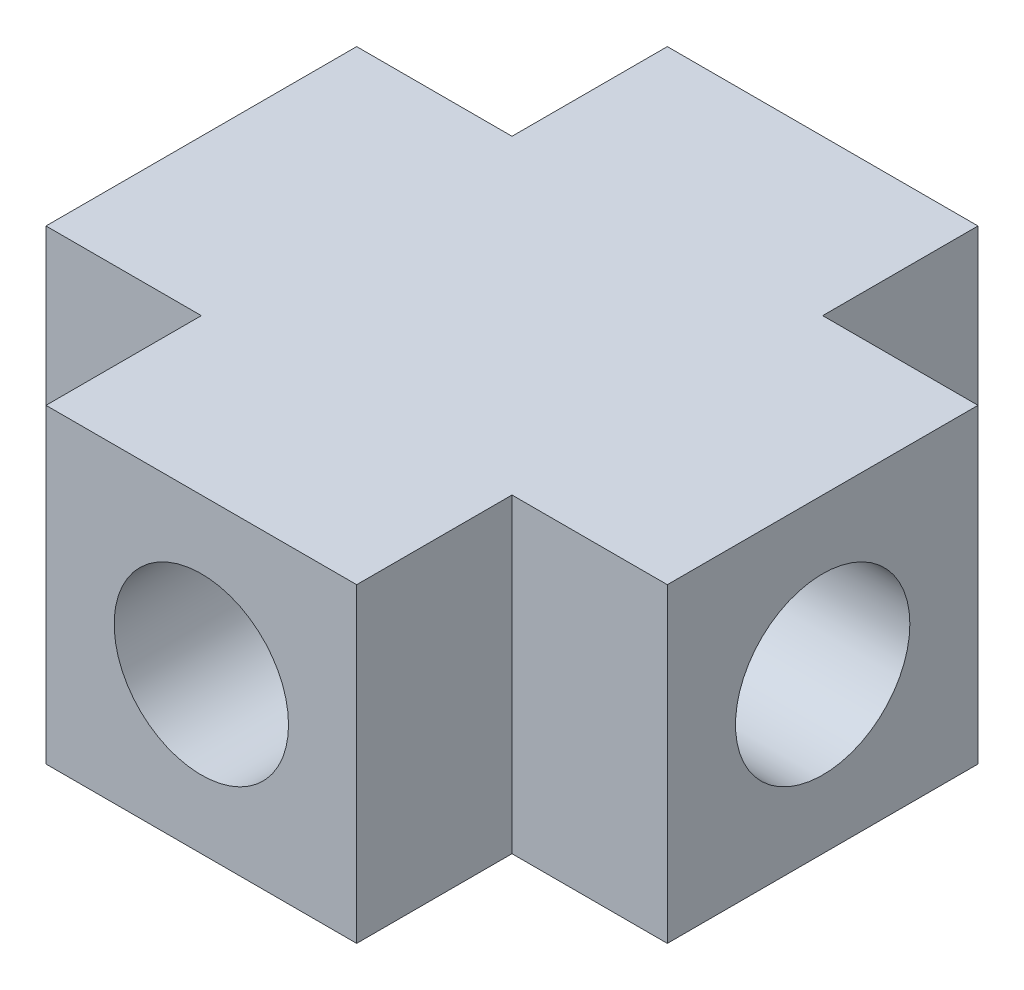
ISO-10303-21;
HEADER;
FILE_DESCRIPTION(('STEP AP214'),'2;1');
FILE_NAME('part.step','',(''),(''),'','','');
FILE_SCHEMA(('AUTOMOTIVE_DESIGN { 1 0 10303 214 1 1 1 1 }'));
ENDSEC;
DATA;
#1=APPLICATION_CONTEXT('core data for automotive mechanical design processes');
#2=APPLICATION_PROTOCOL_DEFINITION('international standard','automotive_design',2000,#1);
#3=PRODUCT_CONTEXT('',#1,'mechanical');
#4=PRODUCT('Part','Part','',(#3));
#5=PRODUCT_RELATED_PRODUCT_CATEGORY('part','',(#4));
#6=PRODUCT_DEFINITION_FORMATION('','',#4);
#7=PRODUCT_DEFINITION_CONTEXT('part definition',#1,'design');
#8=PRODUCT_DEFINITION('design','',#6,#7);
#9=PRODUCT_DEFINITION_SHAPE('','',#8);
#10=(LENGTH_UNIT() NAMED_UNIT(*) SI_UNIT(.MILLI.,.METRE.));
#11=(NAMED_UNIT(*) PLANE_ANGLE_UNIT() SI_UNIT($,.RADIAN.));
#12=(NAMED_UNIT(*) SI_UNIT($,.STERADIAN.) SOLID_ANGLE_UNIT());
#13=UNCERTAINTY_MEASURE_WITH_UNIT(LENGTH_MEASURE(1.E-05),#10,'distance_accuracy_value','');
#14=(GEOMETRIC_REPRESENTATION_CONTEXT(3) GLOBAL_UNCERTAINTY_ASSIGNED_CONTEXT((#13)) GLOBAL_UNIT_ASSIGNED_CONTEXT((#10,
#11,#12)) REPRESENTATION_CONTEXT('',''));
#15=CARTESIAN_POINT('',(0.,0.,0.));
#16=DIRECTION('',(0.,0.,1.));
#17=DIRECTION('',(1.,0.,0.));
#18=AXIS2_PLACEMENT_3D('',#15,#16,#17);
#19=CARTESIAN_POINT('',(0.,5.,10.));
#20=DIRECTION('',(0.,0.,-1.));
#21=DIRECTION('',(-1.,0.,0.));
#22=AXIS2_PLACEMENT_3D('',#19,#20,#21);
#23=PLANE('',#22);
#24=CARTESIAN_POINT('',(0.,0.,10.));
#25=DIRECTION('',(0.,0.,1.));
#26=DIRECTION('',(1.,0.,0.));
#27=AXIS2_PLACEMENT_3D('',#24,#25,#26);
#28=CIRCLE('',#27,2.8067);
#29=CARTESIAN_POINT('',(2.8067,0.,10.));
#30=VERTEX_POINT('',#29);
#31=EDGE_CURVE('E299',#30,#30,#28,.T.);
#32=ORIENTED_EDGE('',*,*,#31,.F.);
#33=EDGE_LOOP('',(#32));
#34=FACE_BOUND('',#33,.T.);
#35=DIRECTION('',(1.,0.,0.));
#36=VECTOR('',#35,1.);
#37=CARTESIAN_POINT('',(0.,-5.,10.));
#38=LINE('',#37,#36);
#39=CARTESIAN_POINT('',(-5.,-5.,10.));
#40=VERTEX_POINT('',#39);
#41=CARTESIAN_POINT('',(5.,-5.,10.));
#42=VERTEX_POINT('',#41);
#43=EDGE_CURVE('E168',#40,#42,#38,.T.);
#44=ORIENTED_EDGE('',*,*,#43,.T.);
#45=DIRECTION('',(0.,-1.,0.));
#46=VECTOR('',#45,1.);
#47=CARTESIAN_POINT('',(5.,5.,10.));
#48=LINE('',#47,#46);
#49=CARTESIAN_POINT('',(5.,5.,10.));
#50=VERTEX_POINT('',#49);
#51=EDGE_CURVE('E11',#50,#42,#48,.T.);
#52=ORIENTED_EDGE('',*,*,#51,.F.);
#53=DIRECTION('',(1.,0.,0.));
#54=VECTOR('',#53,1.);
#55=CARTESIAN_POINT('',(0.,5.,10.));
#56=LINE('',#55,#54);
#57=CARTESIAN_POINT('',(-5.,5.,10.));
#58=VERTEX_POINT('',#57);
#59=EDGE_CURVE('E211',#58,#50,#56,.T.);
#60=ORIENTED_EDGE('',*,*,#59,.F.);
#61=DIRECTION('',(0.,-1.,0.));
#62=VECTOR('',#61,1.);
#63=CARTESIAN_POINT('',(-5.,5.,10.));
#64=LINE('',#63,#62);
#65=EDGE_CURVE('E56',#58,#40,#64,.T.);
#66=ORIENTED_EDGE('',*,*,#65,.T.);
#67=EDGE_LOOP('',(#44,#52,#60,#66));
#68=FACE_BOUND('',#67,.T.);
#69=ADVANCED_FACE('F39',(#34,#68),#23,.F.);
#70=CARTESIAN_POINT('',(5.,5.,0.));
#71=DIRECTION('',(-1.,0.,0.));
#72=DIRECTION('',(0.,0.,1.));
#73=AXIS2_PLACEMENT_3D('',#70,#71,#72);
#74=PLANE('',#73);
#75=DIRECTION('',(0.,0.,-1.));
#76=VECTOR('',#75,1.);
#77=CARTESIAN_POINT('',(5.,-5.,0.));
#78=LINE('',#77,#76);
#79=CARTESIAN_POINT('',(5.,-5.,5.));
#80=VERTEX_POINT('',#79);
#81=EDGE_CURVE('E171',#42,#80,#78,.T.);
#82=ORIENTED_EDGE('',*,*,#81,.T.);
#83=DIRECTION('',(0.,-1.,0.));
#84=VECTOR('',#83,1.);
#85=CARTESIAN_POINT('',(5.,5.,5.));
#86=LINE('',#85,#84);
#87=CARTESIAN_POINT('',(5.,5.,5.));
#88=VERTEX_POINT('',#87);
#89=EDGE_CURVE('E48',#88,#80,#86,.T.);
#90=ORIENTED_EDGE('',*,*,#89,.F.);
#91=DIRECTION('',(0.,0.,-1.));
#92=VECTOR('',#91,1.);
#93=CARTESIAN_POINT('',(5.,5.,0.));
#94=LINE('',#93,#92);
#95=EDGE_CURVE('E107',#50,#88,#94,.T.);
#96=ORIENTED_EDGE('',*,*,#95,.F.);
#97=ORIENTED_EDGE('',*,*,#51,.T.);
#98=EDGE_LOOP('',(#82,#90,#96,#97));
#99=FACE_BOUND('',#98,.T.);
#100=ADVANCED_FACE('F292',(#99),#74,.F.);
#101=CARTESIAN_POINT('',(0.,5.,5.));
#102=DIRECTION('',(0.,0.,-1.));
#103=DIRECTION('',(-1.,0.,0.));
#104=AXIS2_PLACEMENT_3D('',#101,#102,#103);
#105=PLANE('',#104);
#106=DIRECTION('',(1.,0.,0.));
#107=VECTOR('',#106,1.);
#108=CARTESIAN_POINT('',(0.,-5.,5.));
#109=LINE('',#108,#107);
#110=CARTESIAN_POINT('',(10.,-5.,5.));
#111=VERTEX_POINT('',#110);
#112=EDGE_CURVE('E175',#80,#111,#109,.T.);
#113=ORIENTED_EDGE('',*,*,#112,.T.);
#114=DIRECTION('',(0.,-1.,0.));
#115=VECTOR('',#114,1.);
#116=CARTESIAN_POINT('',(10.,5.,5.));
#117=LINE('',#116,#115);
#118=CARTESIAN_POINT('',(10.,5.,5.));
#119=VERTEX_POINT('',#118);
#120=EDGE_CURVE('E233',#119,#111,#117,.T.);
#121=ORIENTED_EDGE('',*,*,#120,.F.);
#122=DIRECTION('',(1.,0.,0.));
#123=VECTOR('',#122,1.);
#124=CARTESIAN_POINT('',(0.,5.,5.));
#125=LINE('',#124,#123);
#126=EDGE_CURVE('E243',#88,#119,#125,.T.);
#127=ORIENTED_EDGE('',*,*,#126,.F.);
#128=ORIENTED_EDGE('',*,*,#89,.T.);
#129=EDGE_LOOP('',(#113,#121,#127,#128));
#130=FACE_BOUND('',#129,.T.);
#131=ADVANCED_FACE('F241',(#130),#105,.F.);
#132=CARTESIAN_POINT('',(10.,5.,0.));
#133=DIRECTION('',(-1.,0.,0.));
#134=DIRECTION('',(0.,0.,1.));
#135=AXIS2_PLACEMENT_3D('',#132,#133,#134);
#136=PLANE('',#135);
#137=CARTESIAN_POINT('',(10.,0.,1.05664416215304E-13));
#138=DIRECTION('',(1.,0.,0.));
#139=DIRECTION('',(0.,0.,-1.));
#140=AXIS2_PLACEMENT_3D('',#137,#138,#139);
#141=CIRCLE('',#140,2.8067);
#142=CARTESIAN_POINT('',(10.,0.,-2.80669999999989));
#143=VERTEX_POINT('',#142);
#144=EDGE_CURVE('E311',#143,#143,#141,.T.);
#145=ORIENTED_EDGE('',*,*,#144,.F.);
#146=EDGE_LOOP('',(#145));
#147=FACE_BOUND('',#146,.T.);
#148=DIRECTION('',(0.,0.,-1.));
#149=VECTOR('',#148,1.);
#150=CARTESIAN_POINT('',(10.,-5.,0.));
#151=LINE('',#150,#149);
#152=CARTESIAN_POINT('',(10.,-5.,-5.));
#153=VERTEX_POINT('',#152);
#154=EDGE_CURVE('E178',#111,#153,#151,.T.);
#155=ORIENTED_EDGE('',*,*,#154,.T.);
#156=DIRECTION('',(0.,-1.,0.));
#157=VECTOR('',#156,1.);
#158=CARTESIAN_POINT('',(10.,5.,-5.));
#159=LINE('',#158,#157);
#160=CARTESIAN_POINT('',(10.,5.,-5.));
#161=VERTEX_POINT('',#160);
#162=EDGE_CURVE('E230',#161,#153,#159,.T.);
#163=ORIENTED_EDGE('',*,*,#162,.F.);
#164=DIRECTION('',(0.,0.,-1.));
#165=VECTOR('',#164,1.);
#166=CARTESIAN_POINT('',(10.,5.,0.));
#167=LINE('',#166,#165);
#168=EDGE_CURVE('E254',#119,#161,#167,.T.);
#169=ORIENTED_EDGE('',*,*,#168,.F.);
#170=ORIENTED_EDGE('',*,*,#120,.T.);
#171=EDGE_LOOP('',(#155,#163,#169,#170));
#172=FACE_BOUND('',#171,.T.);
#173=ADVANCED_FACE('F251',(#147,#172),#136,.F.);
#174=CARTESIAN_POINT('',(0.,5.,-5.));
#175=DIRECTION('',(0.,0.,-1.));
#176=DIRECTION('',(-1.,0.,0.));
#177=AXIS2_PLACEMENT_3D('',#174,#175,#176);
#178=PLANE('',#177);
#179=DIRECTION('',(1.,0.,0.));
#180=VECTOR('',#179,1.);
#181=CARTESIAN_POINT('',(0.,-5.,-5.));
#182=LINE('',#181,#180);
#183=CARTESIAN_POINT('',(5.,-5.,-5.));
#184=VERTEX_POINT('',#183);
#185=EDGE_CURVE('E182',#184,#153,#182,.T.);
#186=ORIENTED_EDGE('',*,*,#185,.F.);
#187=DIRECTION('',(0.,-1.,0.));
#188=VECTOR('',#187,1.);
#189=CARTESIAN_POINT('',(5.,5.,-5.));
#190=LINE('',#189,#188);
#191=CARTESIAN_POINT('',(5.,5.,-5.));
#192=VERTEX_POINT('',#191);
#193=EDGE_CURVE('E227',#192,#184,#190,.T.);
#194=ORIENTED_EDGE('',*,*,#193,.F.);
#195=DIRECTION('',(1.,0.,0.));
#196=VECTOR('',#195,1.);
#197=CARTESIAN_POINT('',(0.,5.,-5.));
#198=LINE('',#197,#196);
#199=EDGE_CURVE('E257',#192,#161,#198,.T.);
#200=ORIENTED_EDGE('',*,*,#199,.T.);
#201=ORIENTED_EDGE('',*,*,#162,.T.);
#202=EDGE_LOOP('',(#186,#194,#200,#201));
#203=FACE_BOUND('',#202,.T.);
#204=ADVANCED_FACE('F360',(#203),#178,.T.);
#205=CARTESIAN_POINT('',(5.,5.,0.));
#206=DIRECTION('',(-1.,0.,0.));
#207=DIRECTION('',(0.,0.,1.));
#208=AXIS2_PLACEMENT_3D('',#205,#206,#207);
#209=PLANE('',#208);
#210=DIRECTION('',(0.,0.,-1.));
#211=VECTOR('',#210,1.);
#212=CARTESIAN_POINT('',(5.,-5.,0.));
#213=LINE('',#212,#211);
#214=CARTESIAN_POINT('',(5.,-5.,-10.));
#215=VERTEX_POINT('',#214);
#216=EDGE_CURVE('E186',#184,#215,#213,.T.);
#217=ORIENTED_EDGE('',*,*,#216,.T.);
#218=DIRECTION('',(0.,-1.,0.));
#219=VECTOR('',#218,1.);
#220=CARTESIAN_POINT('',(5.,5.,-10.));
#221=LINE('',#220,#219);
#222=CARTESIAN_POINT('',(5.,5.,-10.));
#223=VERTEX_POINT('',#222);
#224=EDGE_CURVE('E224',#223,#215,#221,.T.);
#225=ORIENTED_EDGE('',*,*,#224,.F.);
#226=DIRECTION('',(0.,0.,-1.));
#227=VECTOR('',#226,1.);
#228=CARTESIAN_POINT('',(5.,5.,0.));
#229=LINE('',#228,#227);
#230=EDGE_CURVE('E261',#192,#223,#229,.T.);
#231=ORIENTED_EDGE('',*,*,#230,.F.);
#232=ORIENTED_EDGE('',*,*,#193,.T.);
#233=EDGE_LOOP('',(#217,#225,#231,#232));
#234=FACE_BOUND('',#233,.T.);
#235=ADVANCED_FACE('F356',(#234),#209,.F.);
#236=CARTESIAN_POINT('',(0.,5.,-10.));
#237=DIRECTION('',(0.,0.,-1.));
#238=DIRECTION('',(-1.,0.,0.));
#239=AXIS2_PLACEMENT_3D('',#236,#237,#238);
#240=PLANE('',#239);
#241=CARTESIAN_POINT('',(0.,0.,-10.));
#242=DIRECTION('',(0.,0.,-1.));
#243=DIRECTION('',(-1.,0.,0.));
#244=AXIS2_PLACEMENT_3D('',#241,#242,#243);
#245=CIRCLE('',#244,2.8067);
#246=CARTESIAN_POINT('',(-2.8067,0.,-10.));
#247=VERTEX_POINT('',#246);
#248=EDGE_CURVE('E319',#247,#247,#245,.T.);
#249=ORIENTED_EDGE('',*,*,#248,.F.);
#250=EDGE_LOOP('',(#249));
#251=FACE_BOUND('',#250,.T.);
#252=DIRECTION('',(1.,0.,0.));
#253=VECTOR('',#252,1.);
#254=CARTESIAN_POINT('',(0.,-5.,-10.));
#255=LINE('',#254,#253);
#256=CARTESIAN_POINT('',(-5.,-5.,-10.));
#257=VERTEX_POINT('',#256);
#258=EDGE_CURVE('E190',#257,#215,#255,.T.);
#259=ORIENTED_EDGE('',*,*,#258,.F.);
#260=DIRECTION('',(0.,-1.,0.));
#261=VECTOR('',#260,1.);
#262=CARTESIAN_POINT('',(-5.,5.,-10.));
#263=LINE('',#262,#261);
#264=CARTESIAN_POINT('',(-5.,5.,-10.));
#265=VERTEX_POINT('',#264);
#266=EDGE_CURVE('E221',#265,#257,#263,.T.);
#267=ORIENTED_EDGE('',*,*,#266,.F.);
#268=DIRECTION('',(1.,0.,0.));
#269=VECTOR('',#268,1.);
#270=CARTESIAN_POINT('',(0.,5.,-10.));
#271=LINE('',#270,#269);
#272=EDGE_CURVE('E268',#265,#223,#271,.T.);
#273=ORIENTED_EDGE('',*,*,#272,.T.);
#274=ORIENTED_EDGE('',*,*,#224,.T.);
#275=EDGE_LOOP('',(#259,#267,#273,#274));
#276=FACE_BOUND('',#275,.T.);
#277=ADVANCED_FACE('F353',(#251,#276),#240,.T.);
#278=CARTESIAN_POINT('',(-5.,5.,0.));
#279=DIRECTION('',(-1.,0.,0.));
#280=DIRECTION('',(0.,0.,1.));
#281=AXIS2_PLACEMENT_3D('',#278,#279,#280);
#282=PLANE('',#281);
#283=DIRECTION('',(0.,0.,-1.));
#284=VECTOR('',#283,1.);
#285=CARTESIAN_POINT('',(-5.,-5.,0.));
#286=LINE('',#285,#284);
#287=CARTESIAN_POINT('',(-5.,-5.,-5.));
#288=VERTEX_POINT('',#287);
#289=EDGE_CURVE('E194',#288,#257,#286,.T.);
#290=ORIENTED_EDGE('',*,*,#289,.F.);
#291=DIRECTION('',(0.,-1.,0.));
#292=VECTOR('',#291,1.);
#293=CARTESIAN_POINT('',(-5.,5.,-5.));
#294=LINE('',#293,#292);
#295=CARTESIAN_POINT('',(-5.,5.,-5.));
#296=VERTEX_POINT('',#295);
#297=EDGE_CURVE('E218',#296,#288,#294,.T.);
#298=ORIENTED_EDGE('',*,*,#297,.F.);
#299=DIRECTION('',(0.,0.,-1.));
#300=VECTOR('',#299,1.);
#301=CARTESIAN_POINT('',(-5.,5.,0.));
#302=LINE('',#301,#300);
#303=EDGE_CURVE('E162',#296,#265,#302,.T.);
#304=ORIENTED_EDGE('',*,*,#303,.T.);
#305=ORIENTED_EDGE('',*,*,#266,.T.);
#306=EDGE_LOOP('',(#290,#298,#304,#305));
#307=FACE_BOUND('',#306,.T.);
#308=ADVANCED_FACE('F275',(#307),#282,.T.);
#309=CARTESIAN_POINT('',(0.,5.,-5.));
#310=DIRECTION('',(0.,0.,-1.));
#311=DIRECTION('',(-1.,0.,0.));
#312=AXIS2_PLACEMENT_3D('',#309,#310,#311);
#313=PLANE('',#312);
#314=DIRECTION('',(1.,0.,0.));
#315=VECTOR('',#314,1.);
#316=CARTESIAN_POINT('',(0.,-5.,-5.));
#317=LINE('',#316,#315);
#318=CARTESIAN_POINT('',(-10.,-5.,-5.));
#319=VERTEX_POINT('',#318);
#320=EDGE_CURVE('E198',#319,#288,#317,.T.);
#321=ORIENTED_EDGE('',*,*,#320,.F.);
#322=DIRECTION('',(0.,-1.,0.));
#323=VECTOR('',#322,1.);
#324=CARTESIAN_POINT('',(-10.,5.,-5.));
#325=LINE('',#324,#323);
#326=CARTESIAN_POINT('',(-10.,5.,-5.));
#327=VERTEX_POINT('',#326);
#328=EDGE_CURVE('E145',#327,#319,#325,.T.);
#329=ORIENTED_EDGE('',*,*,#328,.F.);
#330=DIRECTION('',(1.,0.,0.));
#331=VECTOR('',#330,1.);
#332=CARTESIAN_POINT('',(0.,5.,-5.));
#333=LINE('',#332,#331);
#334=EDGE_CURVE('E158',#327,#296,#333,.T.);
#335=ORIENTED_EDGE('',*,*,#334,.T.);
#336=ORIENTED_EDGE('',*,*,#297,.T.);
#337=EDGE_LOOP('',(#321,#329,#335,#336));
#338=FACE_BOUND('',#337,.T.);
#339=ADVANCED_FACE('F280',(#338),#313,.T.);
#340=CARTESIAN_POINT('',(-10.,5.,0.));
#341=DIRECTION('',(-1.,0.,0.));
#342=DIRECTION('',(0.,0.,1.));
#343=AXIS2_PLACEMENT_3D('',#340,#341,#342);
#344=PLANE('',#343);
#345=CARTESIAN_POINT('',(-10.,0.,0.));
#346=DIRECTION('',(-1.,0.,0.));
#347=DIRECTION('',(0.,0.,1.));
#348=AXIS2_PLACEMENT_3D('',#345,#346,#347);
#349=CIRCLE('',#348,2.8067);
#350=CARTESIAN_POINT('',(-10.,0.,2.80669999999996));
#351=VERTEX_POINT('',#350);
#352=EDGE_CURVE('E327',#351,#351,#349,.T.);
#353=ORIENTED_EDGE('',*,*,#352,.F.);
#354=EDGE_LOOP('',(#353));
#355=FACE_BOUND('',#354,.T.);
#356=DIRECTION('',(0.,0.,-1.));
#357=VECTOR('',#356,1.);
#358=CARTESIAN_POINT('',(-10.,-5.,0.));
#359=LINE('',#358,#357);
#360=CARTESIAN_POINT('',(-10.,-5.,5.));
#361=VERTEX_POINT('',#360);
#362=EDGE_CURVE('E141',#361,#319,#359,.T.);
#363=ORIENTED_EDGE('',*,*,#362,.F.);
#364=DIRECTION('',(0.,-1.,0.));
#365=VECTOR('',#364,1.);
#366=CARTESIAN_POINT('',(-10.,5.,5.));
#367=LINE('',#366,#365);
#368=CARTESIAN_POINT('',(-10.,5.,5.));
#369=VERTEX_POINT('',#368);
#370=EDGE_CURVE('E135',#369,#361,#367,.T.);
#371=ORIENTED_EDGE('',*,*,#370,.F.);
#372=DIRECTION('',(0.,0.,-1.));
#373=VECTOR('',#372,1.);
#374=CARTESIAN_POINT('',(-10.,5.,0.));
#375=LINE('',#374,#373);
#376=EDGE_CURVE('E139',#369,#327,#375,.T.);
#377=ORIENTED_EDGE('',*,*,#376,.T.);
#378=ORIENTED_EDGE('',*,*,#328,.T.);
#379=EDGE_LOOP('',(#363,#371,#377,#378));
#380=FACE_BOUND('',#379,.T.);
#381=ADVANCED_FACE('F137',(#355,#380),#344,.T.);
#382=CARTESIAN_POINT('',(0.,5.,5.));
#383=DIRECTION('',(0.,0.,-1.));
#384=DIRECTION('',(-1.,0.,0.));
#385=AXIS2_PLACEMENT_3D('',#382,#383,#384);
#386=PLANE('',#385);
#387=DIRECTION('',(1.,0.,0.));
#388=VECTOR('',#387,1.);
#389=CARTESIAN_POINT('',(0.,-5.,5.));
#390=LINE('',#389,#388);
#391=CARTESIAN_POINT('',(-5.,-5.,5.));
#392=VERTEX_POINT('',#391);
#393=EDGE_CURVE('E204',#361,#392,#390,.T.);
#394=ORIENTED_EDGE('',*,*,#393,.T.);
#395=DIRECTION('',(0.,-1.,0.));
#396=VECTOR('',#395,1.);
#397=CARTESIAN_POINT('',(-5.,5.,5.));
#398=LINE('',#397,#396);
#399=CARTESIAN_POINT('',(-5.,5.,5.));
#400=VERTEX_POINT('',#399);
#401=EDGE_CURVE('E95',#400,#392,#398,.T.);
#402=ORIENTED_EDGE('',*,*,#401,.F.);
#403=DIRECTION('',(1.,0.,0.));
#404=VECTOR('',#403,1.);
#405=CARTESIAN_POINT('',(0.,5.,5.));
#406=LINE('',#405,#404);
#407=EDGE_CURVE('E147',#369,#400,#406,.T.);
#408=ORIENTED_EDGE('',*,*,#407,.F.);
#409=ORIENTED_EDGE('',*,*,#370,.T.);
#410=EDGE_LOOP('',(#394,#402,#408,#409));
#411=FACE_BOUND('',#410,.T.);
#412=ADVANCED_FACE('F148',(#411),#386,.F.);
#413=CARTESIAN_POINT('',(-5.,5.,0.));
#414=DIRECTION('',(-1.,0.,0.));
#415=DIRECTION('',(0.,0.,1.));
#416=AXIS2_PLACEMENT_3D('',#413,#414,#415);
#417=PLANE('',#416);
#418=DIRECTION('',(0.,0.,-1.));
#419=VECTOR('',#418,1.);
#420=CARTESIAN_POINT('',(-5.,-5.,0.));
#421=LINE('',#420,#419);
#422=EDGE_CURVE('E207',#40,#392,#421,.T.);
#423=ORIENTED_EDGE('',*,*,#422,.F.);
#424=ORIENTED_EDGE('',*,*,#65,.F.);
#425=DIRECTION('',(0.,0.,-1.));
#426=VECTOR('',#425,1.);
#427=CARTESIAN_POINT('',(-5.,5.,0.));
#428=LINE('',#427,#426);
#429=EDGE_CURVE('E152',#58,#400,#428,.T.);
#430=ORIENTED_EDGE('',*,*,#429,.T.);
#431=ORIENTED_EDGE('',*,*,#401,.T.);
#432=EDGE_LOOP('',(#423,#424,#430,#431));
#433=FACE_BOUND('',#432,.T.);
#434=ADVANCED_FACE('F281',(#433),#417,.T.);
#435=CARTESIAN_POINT('',(0.,5.,0.));
#436=DIRECTION('',(0.,1.,0.));
#437=DIRECTION('',(0.,0.,1.));
#438=AXIS2_PLACEMENT_3D('',#435,#436,#437);
#439=PLANE('',#438);
#440=ORIENTED_EDGE('',*,*,#59,.T.);
#441=ORIENTED_EDGE('',*,*,#95,.T.);
#442=ORIENTED_EDGE('',*,*,#126,.T.);
#443=ORIENTED_EDGE('',*,*,#168,.T.);
#444=ORIENTED_EDGE('',*,*,#199,.F.);
#445=ORIENTED_EDGE('',*,*,#230,.T.);
#446=ORIENTED_EDGE('',*,*,#272,.F.);
#447=ORIENTED_EDGE('',*,*,#303,.F.);
#448=ORIENTED_EDGE('',*,*,#334,.F.);
#449=ORIENTED_EDGE('',*,*,#376,.F.);
#450=ORIENTED_EDGE('',*,*,#407,.T.);
#451=ORIENTED_EDGE('',*,*,#429,.F.);
#452=EDGE_LOOP('',(#440,#441,#442,#443,#444,#445,#446,#447,#448,#449,#450,#451));
#453=FACE_BOUND('',#452,.T.);
#454=ADVANCED_FACE('F155',(#453),#439,.T.);
#455=CARTESIAN_POINT('',(0.,-5.,0.));
#456=DIRECTION('',(0.,1.,0.));
#457=DIRECTION('',(0.,0.,1.));
#458=AXIS2_PLACEMENT_3D('',#455,#456,#457);
#459=PLANE('',#458);
#460=ORIENTED_EDGE('',*,*,#43,.F.);
#461=ORIENTED_EDGE('',*,*,#422,.T.);
#462=ORIENTED_EDGE('',*,*,#393,.F.);
#463=ORIENTED_EDGE('',*,*,#362,.T.);
#464=ORIENTED_EDGE('',*,*,#320,.T.);
#465=ORIENTED_EDGE('',*,*,#289,.T.);
#466=ORIENTED_EDGE('',*,*,#258,.T.);
#467=ORIENTED_EDGE('',*,*,#216,.F.);
#468=ORIENTED_EDGE('',*,*,#185,.T.);
#469=ORIENTED_EDGE('',*,*,#154,.F.);
#470=ORIENTED_EDGE('',*,*,#112,.F.);
#471=ORIENTED_EDGE('',*,*,#81,.F.);
#472=EDGE_LOOP('',(#460,#461,#462,#463,#464,#465,#466,#467,#468,#469,#470,#471));
#473=FACE_BOUND('',#472,.T.);
#474=ADVANCED_FACE('F246',(#473),#459,.F.);
#475=CARTESIAN_POINT('',(0.,0.,5.));
#476=DIRECTION('',(0.,0.,1.));
#477=DIRECTION('',(1.,0.,0.));
#478=AXIS2_PLACEMENT_3D('',#475,#476,#477);
#479=CYLINDRICAL_SURFACE('',#478,2.8067);
#480=CARTESIAN_POINT('',(0.,0.,5.));
#481=DIRECTION('',(0.,0.,1.));
#482=DIRECTION('',(1.,0.,0.));
#483=AXIS2_PLACEMENT_3D('',#480,#481,#482);
#484=CIRCLE('',#483,2.8067);
#485=CARTESIAN_POINT('',(2.8067,0.,5.));
#486=VERTEX_POINT('',#485);
#487=EDGE_CURVE('E172',#486,#486,#484,.T.);
#488=ORIENTED_EDGE('',*,*,#487,.F.);
#489=EDGE_LOOP('',(#488));
#490=FACE_BOUND('',#489,.T.);
#491=ORIENTED_EDGE('',*,*,#31,.T.);
#492=EDGE_LOOP('',(#491));
#493=FACE_BOUND('',#492,.T.);
#494=ADVANCED_FACE('F426',(#490,#493),#479,.F.);
#495=CARTESIAN_POINT('',(0.,0.,5.));
#496=DIRECTION('',(0.,0.,1.));
#497=DIRECTION('',(1.,0.,0.));
#498=AXIS2_PLACEMENT_3D('',#495,#496,#497);
#499=PLANE('',#498);
#500=ORIENTED_EDGE('',*,*,#487,.T.);
#501=EDGE_LOOP('',(#500));
#502=FACE_BOUND('',#501,.T.);
#503=ADVANCED_FACE('F340',(#502),#499,.T.);
#504=CARTESIAN_POINT('',(-5.,0.,0.));
#505=DIRECTION('',(-1.,0.,0.));
#506=DIRECTION('',(0.,0.,1.));
#507=AXIS2_PLACEMENT_3D('',#504,#505,#506);
#508=CYLINDRICAL_SURFACE('',#507,2.8067);
#509=CARTESIAN_POINT('',(-5.,0.,0.));
#510=DIRECTION('',(-1.,0.,0.));
#511=DIRECTION('',(0.,0.,1.));
#512=AXIS2_PLACEMENT_3D('',#509,#510,#511);
#513=CIRCLE('',#512,2.8067);
#514=CARTESIAN_POINT('',(-5.00000000000001,0.,2.80669999999998));
#515=VERTEX_POINT('',#514);
#516=EDGE_CURVE('E307',#515,#515,#513,.T.);
#517=ORIENTED_EDGE('',*,*,#516,.F.);
#518=EDGE_LOOP('',(#517));
#519=FACE_BOUND('',#518,.T.);
#520=ORIENTED_EDGE('',*,*,#352,.T.);
#521=EDGE_LOOP('',(#520));
#522=FACE_BOUND('',#521,.T.);
#523=ADVANCED_FACE('F337',(#519,#522),#508,.F.);
#524=CARTESIAN_POINT('',(-5.,0.,0.));
#525=DIRECTION('',(-1.,0.,0.));
#526=DIRECTION('',(0.,0.,1.));
#527=AXIS2_PLACEMENT_3D('',#524,#525,#526);
#528=PLANE('',#527);
#529=ORIENTED_EDGE('',*,*,#516,.T.);
#530=EDGE_LOOP('',(#529));
#531=FACE_BOUND('',#530,.T.);
#532=ADVANCED_FACE('F335',(#531),#528,.T.);
#533=CARTESIAN_POINT('',(0.,0.,-5.));
#534=DIRECTION('',(0.,0.,-1.));
#535=DIRECTION('',(-1.,0.,0.));
#536=AXIS2_PLACEMENT_3D('',#533,#534,#535);
#537=CYLINDRICAL_SURFACE('',#536,2.8067);
#538=CARTESIAN_POINT('',(0.,0.,-5.));
#539=DIRECTION('',(0.,0.,-1.));
#540=DIRECTION('',(-1.,0.,0.));
#541=AXIS2_PLACEMENT_3D('',#538,#539,#540);
#542=CIRCLE('',#541,2.8067);
#543=CARTESIAN_POINT('',(-2.8067,0.,-5.));
#544=VERTEX_POINT('',#543);
#545=EDGE_CURVE('E323',#544,#544,#542,.T.);
#546=ORIENTED_EDGE('',*,*,#545,.F.);
#547=EDGE_LOOP('',(#546));
#548=FACE_BOUND('',#547,.T.);
#549=ORIENTED_EDGE('',*,*,#248,.T.);
#550=EDGE_LOOP('',(#549));
#551=FACE_BOUND('',#550,.T.);
#552=ADVANCED_FACE('F461',(#548,#551),#537,.F.);
#553=CARTESIAN_POINT('',(0.,0.,-5.));
#554=DIRECTION('',(0.,0.,-1.));
#555=DIRECTION('',(-1.,0.,0.));
#556=AXIS2_PLACEMENT_3D('',#553,#554,#555);
#557=PLANE('',#556);
#558=ORIENTED_EDGE('',*,*,#545,.T.);
#559=EDGE_LOOP('',(#558));
#560=FACE_BOUND('',#559,.T.);
#561=ADVANCED_FACE('F468',(#560),#557,.T.);
#562=CARTESIAN_POINT('',(5.,0.,0.));
#563=DIRECTION('',(1.,0.,0.));
#564=DIRECTION('',(0.,0.,-1.));
#565=AXIS2_PLACEMENT_3D('',#562,#563,#564);
#566=CYLINDRICAL_SURFACE('',#565,2.8067);
#567=CARTESIAN_POINT('',(5.,0.,0.));
#568=DIRECTION('',(1.,0.,0.));
#569=DIRECTION('',(0.,0.,-1.));
#570=AXIS2_PLACEMENT_3D('',#567,#568,#569);
#571=CIRCLE('',#570,2.8067);
#572=CARTESIAN_POINT('',(5.00000000000003,0.,-2.80669999999995));
#573=VERTEX_POINT('',#572);
#574=EDGE_CURVE('E315',#573,#573,#571,.T.);
#575=ORIENTED_EDGE('',*,*,#574,.F.);
#576=EDGE_LOOP('',(#575));
#577=FACE_BOUND('',#576,.T.);
#578=ORIENTED_EDGE('',*,*,#144,.T.);
#579=EDGE_LOOP('',(#578));
#580=FACE_BOUND('',#579,.T.);
#581=ADVANCED_FACE('F476',(#577,#580),#566,.F.);
#582=CARTESIAN_POINT('',(5.,0.,0.));
#583=DIRECTION('',(1.,0.,0.));
#584=DIRECTION('',(0.,0.,-1.));
#585=AXIS2_PLACEMENT_3D('',#582,#583,#584);
#586=PLANE('',#585);
#587=ORIENTED_EDGE('',*,*,#574,.T.);
#588=EDGE_LOOP('',(#587));
#589=FACE_BOUND('',#588,.T.);
#590=ADVANCED_FACE('F484',(#589),#586,.T.);
#591=CLOSED_SHELL('',(#69,#100,#131,#173,#204,#235,#277,#308,#339,#381,#412,#434,#454,#474,#494,
#503,#523,#532,#552,#561,#581,#590));
#592=MANIFOLD_SOLID_BREP('B2',#591);
#593=ADVANCED_BREP_SHAPE_REPRESENTATION('',(#18,#592),#14);
#594=SHAPE_DEFINITION_REPRESENTATION(#9,#593);
ENDSEC;
END-ISO-10303-21;
